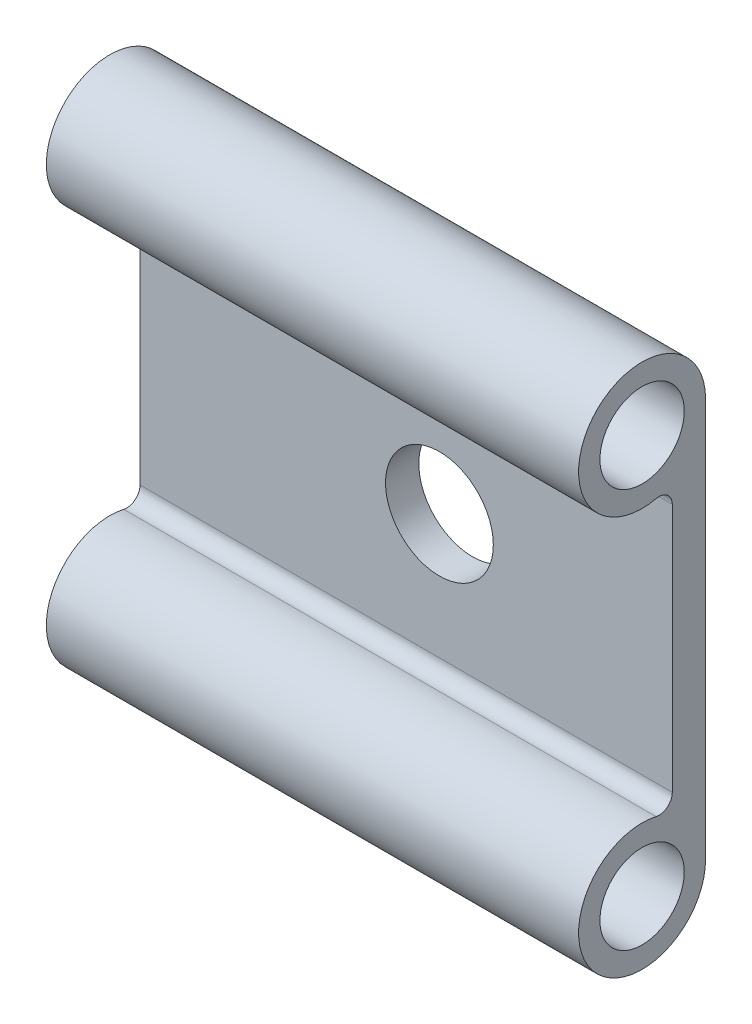
ISO-10303-21;
HEADER;
FILE_DESCRIPTION(('STEP AP214'),'2;1');
FILE_NAME('part.step','',(''),(''),'','','');
FILE_SCHEMA(('AUTOMOTIVE_DESIGN { 1 0 10303 214 1 1 1 1 }'));
ENDSEC;
DATA;
#1=APPLICATION_CONTEXT('core data for automotive mechanical design processes');
#2=APPLICATION_PROTOCOL_DEFINITION('international standard','automotive_design',2000,#1);
#3=PRODUCT_CONTEXT('',#1,'mechanical');
#4=PRODUCT('Part','Part','',(#3));
#5=PRODUCT_RELATED_PRODUCT_CATEGORY('part','',(#4));
#6=PRODUCT_DEFINITION_FORMATION('','',#4);
#7=PRODUCT_DEFINITION_CONTEXT('part definition',#1,'design');
#8=PRODUCT_DEFINITION('design','',#6,#7);
#9=PRODUCT_DEFINITION_SHAPE('','',#8);
#10=(LENGTH_UNIT() NAMED_UNIT(*) SI_UNIT(.MILLI.,.METRE.));
#11=(NAMED_UNIT(*) PLANE_ANGLE_UNIT() SI_UNIT($,.RADIAN.));
#12=(NAMED_UNIT(*) SI_UNIT($,.STERADIAN.) SOLID_ANGLE_UNIT());
#13=UNCERTAINTY_MEASURE_WITH_UNIT(LENGTH_MEASURE(1.E-05),#10,'distance_accuracy_value','');
#14=(GEOMETRIC_REPRESENTATION_CONTEXT(3) GLOBAL_UNCERTAINTY_ASSIGNED_CONTEXT((#13)) GLOBAL_UNIT_ASSIGNED_CONTEXT((#10,
#11,#12)) REPRESENTATION_CONTEXT('',''));
#15=CARTESIAN_POINT('',(0.,0.,0.));
#16=DIRECTION('',(0.,0.,1.));
#17=DIRECTION('',(1.,0.,0.));
#18=AXIS2_PLACEMENT_3D('',#15,#16,#17);
#19=CARTESIAN_POINT('',(50.8,7.1481936179709,-1.6129));
#20=DIRECTION('',(-1.,0.,0.));
#21=DIRECTION('',(0.,0.,1.));
#22=AXIS2_PLACEMENT_3D('',#19,#20,#21);
#23=PLANE('',#22);
#24=CARTESIAN_POINT('',(50.8,7.1481936179709,-1.6129));
#25=DIRECTION('',(-1.,0.,0.));
#26=DIRECTION('',(0.,0.,1.));
#27=AXIS2_PLACEMENT_3D('',#24,#25,#26);
#28=CIRCLE('',#27,1.27);
#29=CARTESIAN_POINT('',(50.8,7.1481936179709,-2.8829));
#30=VERTEX_POINT('',#29);
#31=CARTESIAN_POINT('',(50.8,5.90933857152881,-1.33336793760832));
#32=VERTEX_POINT('',#31);
#33=EDGE_CURVE('E133',#30,#32,#28,.T.);
#34=ORIENTED_EDGE('',*,*,#33,.T.);
#35=CARTESIAN_POINT('',(50.8,0.,0.));
#36=DIRECTION('',(1.,0.,0.));
#37=DIRECTION('',(0.,0.,-1.));
#38=AXIS2_PLACEMENT_3D('',#35,#36,#37);
#39=CIRCLE('',#38,6.0579);
#40=CARTESIAN_POINT('',(50.8,0.,-6.05790000000001));
#41=VERTEX_POINT('',#40);
#42=EDGE_CURVE('E91',#32,#41,#39,.T.);
#43=ORIENTED_EDGE('',*,*,#42,.T.);
#44=DIRECTION('',(0.,1.,0.));
#45=VECTOR('',#44,1.);
#46=CARTESIAN_POINT('',(50.8,38.1,-6.0579));
#47=LINE('',#46,#45);
#48=CARTESIAN_POINT('',(50.8,38.1,-6.0579));
#49=VERTEX_POINT('',#48);
#50=EDGE_CURVE('E104',#41,#49,#47,.T.);
#51=ORIENTED_EDGE('',*,*,#50,.T.);
#52=CARTESIAN_POINT('',(50.8,38.1,0.));
#53=DIRECTION('',(1.,0.,0.));
#54=DIRECTION('',(0.,0.,1.));
#55=AXIS2_PLACEMENT_3D('',#52,#53,#54);
#56=CIRCLE('',#55,6.0579);
#57=CARTESIAN_POINT('',(50.8,32.1906614284712,-1.33336793760832));
#58=VERTEX_POINT('',#57);
#59=EDGE_CURVE('E98',#49,#58,#56,.T.);
#60=ORIENTED_EDGE('',*,*,#59,.T.);
#61=CARTESIAN_POINT('',(50.8,30.9518063820291,-1.6129));
#62=DIRECTION('',(-1.,0.,0.));
#63=DIRECTION('',(0.,0.,-1.));
#64=AXIS2_PLACEMENT_3D('',#61,#62,#63);
#65=CIRCLE('',#64,1.27);
#66=CARTESIAN_POINT('',(50.8,30.9518063820291,-2.8829));
#67=VERTEX_POINT('',#66);
#68=EDGE_CURVE('E102',#58,#67,#65,.T.);
#69=ORIENTED_EDGE('',*,*,#68,.T.);
#70=DIRECTION('',(0.,-1.,0.));
#71=VECTOR('',#70,1.);
#72=CARTESIAN_POINT('',(50.8,30.9518063820291,-2.8829));
#73=LINE('',#72,#71);
#74=EDGE_CURVE('E54',#67,#30,#73,.T.);
#75=ORIENTED_EDGE('',*,*,#74,.T.);
#76=EDGE_LOOP('',(#34,#43,#51,#60,#69,#75));
#77=FACE_BOUND('',#76,.T.);
#78=CARTESIAN_POINT('',(50.8,0.,0.));
#79=DIRECTION('',(1.,0.,0.));
#80=DIRECTION('',(0.,0.,-1.));
#81=AXIS2_PLACEMENT_3D('',#78,#79,#80);
#82=CIRCLE('',#81,4.0259);
#83=CARTESIAN_POINT('',(50.8,0.,-4.0259));
#84=VERTEX_POINT('',#83);
#85=EDGE_CURVE('E126',#84,#84,#82,.T.);
#86=ORIENTED_EDGE('',*,*,#85,.F.);
#87=EDGE_LOOP('',(#86));
#88=FACE_BOUND('',#87,.T.);
#89=CARTESIAN_POINT('',(50.8,38.1,0.));
#90=DIRECTION('',(1.,0.,0.));
#91=DIRECTION('',(0.,0.,-1.));
#92=AXIS2_PLACEMENT_3D('',#89,#90,#91);
#93=CIRCLE('',#92,4.0259);
#94=CARTESIAN_POINT('',(50.8,38.1,-4.0259));
#95=VERTEX_POINT('',#94);
#96=EDGE_CURVE('E187',#95,#95,#93,.T.);
#97=ORIENTED_EDGE('',*,*,#96,.F.);
#98=EDGE_LOOP('',(#97));
#99=FACE_BOUND('',#98,.T.);
#100=ADVANCED_FACE('F37',(#77,#88,#99),#23,.F.);
#101=CARTESIAN_POINT('',(0.,7.1481936179709,-1.6129));
#102=DIRECTION('',(-1.,0.,0.));
#103=DIRECTION('',(0.,0.,1.));
#104=AXIS2_PLACEMENT_3D('',#101,#102,#103);
#105=PLANE('',#104);
#106=CARTESIAN_POINT('',(0.,0.,0.));
#107=DIRECTION('',(1.,0.,0.));
#108=DIRECTION('',(0.,0.,-1.));
#109=AXIS2_PLACEMENT_3D('',#106,#107,#108);
#110=CIRCLE('',#109,4.0259);
#111=CARTESIAN_POINT('',(0.,0.,-4.0259));
#112=VERTEX_POINT('',#111);
#113=EDGE_CURVE('E190',#112,#112,#110,.T.);
#114=ORIENTED_EDGE('',*,*,#113,.T.);
#115=EDGE_LOOP('',(#114));
#116=FACE_BOUND('',#115,.T.);
#117=CARTESIAN_POINT('',(0.,7.1481936179709,-1.6129));
#118=DIRECTION('',(-1.,0.,0.));
#119=DIRECTION('',(0.,0.,1.));
#120=AXIS2_PLACEMENT_3D('',#117,#118,#119);
#121=CIRCLE('',#120,1.27);
#122=CARTESIAN_POINT('',(0.,7.1481936179709,-2.8829));
#123=VERTEX_POINT('',#122);
#124=CARTESIAN_POINT('',(0.,5.90933857152881,-1.33336793760832));
#125=VERTEX_POINT('',#124);
#126=EDGE_CURVE('E122',#123,#125,#121,.T.);
#127=ORIENTED_EDGE('',*,*,#126,.F.);
#128=DIRECTION('',(0.,-1.,0.));
#129=VECTOR('',#128,1.);
#130=CARTESIAN_POINT('',(0.,30.9518063820291,-2.8829));
#131=LINE('',#130,#129);
#132=CARTESIAN_POINT('',(0.,30.9518063820291,-2.8829));
#133=VERTEX_POINT('',#132);
#134=EDGE_CURVE('E83',#133,#123,#131,.T.);
#135=ORIENTED_EDGE('',*,*,#134,.F.);
#136=CARTESIAN_POINT('',(0.,30.9518063820291,-1.6129));
#137=DIRECTION('',(-1.,0.,0.));
#138=DIRECTION('',(0.,0.,-1.));
#139=AXIS2_PLACEMENT_3D('',#136,#137,#138);
#140=CIRCLE('',#139,1.27);
#141=CARTESIAN_POINT('',(0.,32.1906614284712,-1.33336793760832));
#142=VERTEX_POINT('',#141);
#143=EDGE_CURVE('E77',#142,#133,#140,.T.);
#144=ORIENTED_EDGE('',*,*,#143,.F.);
#145=CARTESIAN_POINT('',(0.,38.1,0.));
#146=DIRECTION('',(1.,0.,0.));
#147=DIRECTION('',(0.,0.,1.));
#148=AXIS2_PLACEMENT_3D('',#145,#146,#147);
#149=CIRCLE('',#148,6.0579);
#150=CARTESIAN_POINT('',(0.,38.1,-6.0579));
#151=VERTEX_POINT('',#150);
#152=EDGE_CURVE('E112',#151,#142,#149,.T.);
#153=ORIENTED_EDGE('',*,*,#152,.F.);
#154=DIRECTION('',(0.,1.,0.));
#155=VECTOR('',#154,1.);
#156=CARTESIAN_POINT('',(0.,38.1,-6.0579));
#157=LINE('',#156,#155);
#158=CARTESIAN_POINT('',(0.,0.,-6.05790000000001));
#159=VERTEX_POINT('',#158);
#160=EDGE_CURVE('E128',#159,#151,#157,.T.);
#161=ORIENTED_EDGE('',*,*,#160,.F.);
#162=CARTESIAN_POINT('',(0.,0.,0.));
#163=DIRECTION('',(1.,0.,0.));
#164=DIRECTION('',(0.,0.,-1.));
#165=AXIS2_PLACEMENT_3D('',#162,#163,#164);
#166=CIRCLE('',#165,6.0579);
#167=EDGE_CURVE('E125',#125,#159,#166,.T.);
#168=ORIENTED_EDGE('',*,*,#167,.F.);
#169=EDGE_LOOP('',(#127,#135,#144,#153,#161,#168));
#170=FACE_BOUND('',#169,.T.);
#171=CARTESIAN_POINT('',(0.,38.1,0.));
#172=DIRECTION('',(1.,0.,0.));
#173=DIRECTION('',(0.,0.,-1.));
#174=AXIS2_PLACEMENT_3D('',#171,#172,#173);
#175=CIRCLE('',#174,4.0259);
#176=CARTESIAN_POINT('',(0.,38.1,-4.0259));
#177=VERTEX_POINT('',#176);
#178=EDGE_CURVE('E184',#177,#177,#175,.T.);
#179=ORIENTED_EDGE('',*,*,#178,.T.);
#180=EDGE_LOOP('',(#179));
#181=FACE_BOUND('',#180,.T.);
#182=ADVANCED_FACE('F142',(#116,#170,#181),#105,.T.);
#183=CARTESIAN_POINT('',(50.8,7.1481936179709,-1.6129));
#184=DIRECTION('',(-1.,0.,0.));
#185=DIRECTION('',(0.,0.,1.));
#186=AXIS2_PLACEMENT_3D('',#183,#184,#185);
#187=CYLINDRICAL_SURFACE('',#186,1.27);
#188=ORIENTED_EDGE('',*,*,#126,.T.);
#189=DIRECTION('',(-1.,0.,0.));
#190=VECTOR('',#189,1.);
#191=CARTESIAN_POINT('',(50.8,5.90933857152881,-1.33336793760832));
#192=LINE('',#191,#190);
#193=EDGE_CURVE('E11',#32,#125,#192,.T.);
#194=ORIENTED_EDGE('',*,*,#193,.F.);
#195=ORIENTED_EDGE('',*,*,#33,.F.);
#196=DIRECTION('',(-1.,0.,0.));
#197=VECTOR('',#196,1.);
#198=CARTESIAN_POINT('',(50.8,7.1481936179709,-2.8829));
#199=LINE('',#198,#197);
#200=EDGE_CURVE('E118',#30,#123,#199,.T.);
#201=ORIENTED_EDGE('',*,*,#200,.T.);
#202=EDGE_LOOP('',(#188,#194,#195,#201));
#203=FACE_BOUND('',#202,.T.);
#204=ADVANCED_FACE('F39',(#203),#187,.F.);
#205=CARTESIAN_POINT('',(50.8,0.,0.));
#206=DIRECTION('',(-1.,0.,0.));
#207=DIRECTION('',(0.,0.,1.));
#208=AXIS2_PLACEMENT_3D('',#205,#206,#207);
#209=CYLINDRICAL_SURFACE('',#208,6.0579);
#210=ORIENTED_EDGE('',*,*,#167,.T.);
#211=DIRECTION('',(-1.,0.,0.));
#212=VECTOR('',#211,1.);
#213=CARTESIAN_POINT('',(50.8,0.,-6.05790000000001));
#214=LINE('',#213,#212);
#215=EDGE_CURVE('E46',#41,#159,#214,.T.);
#216=ORIENTED_EDGE('',*,*,#215,.F.);
#217=ORIENTED_EDGE('',*,*,#42,.F.);
#218=ORIENTED_EDGE('',*,*,#193,.T.);
#219=EDGE_LOOP('',(#210,#216,#217,#218));
#220=FACE_BOUND('',#219,.T.);
#221=ADVANCED_FACE('F207',(#220),#209,.T.);
#222=CARTESIAN_POINT('',(50.8,38.1,-6.0579));
#223=DIRECTION('',(0.,0.,1.));
#224=DIRECTION('',(0.,-1.,0.));
#225=AXIS2_PLACEMENT_3D('',#222,#223,#224);
#226=PLANE('',#225);
#227=CARTESIAN_POINT('',(28.575,19.05,-6.05790000000001));
#228=DIRECTION('',(0.,0.,1.));
#229=DIRECTION('',(1.,0.,0.));
#230=AXIS2_PLACEMENT_3D('',#227,#228,#229);
#231=CIRCLE('',#230,5.1435);
#232=CARTESIAN_POINT('',(33.7185,19.05,-6.05790000000001));
#233=VERTEX_POINT('',#232);
#234=EDGE_CURVE('E180',#233,#233,#231,.T.);
#235=ORIENTED_EDGE('',*,*,#234,.T.);
#236=EDGE_LOOP('',(#235));
#237=FACE_BOUND('',#236,.T.);
#238=ORIENTED_EDGE('',*,*,#160,.T.);
#239=DIRECTION('',(-1.,0.,0.));
#240=VECTOR('',#239,1.);
#241=CARTESIAN_POINT('',(50.8,38.1,-6.0579));
#242=LINE('',#241,#240);
#243=EDGE_CURVE('E113',#49,#151,#242,.T.);
#244=ORIENTED_EDGE('',*,*,#243,.F.);
#245=ORIENTED_EDGE('',*,*,#50,.F.);
#246=ORIENTED_EDGE('',*,*,#215,.T.);
#247=EDGE_LOOP('',(#238,#244,#245,#246));
#248=FACE_BOUND('',#247,.T.);
#249=ADVANCED_FACE('F139',(#237,#248),#226,.F.);
#250=CARTESIAN_POINT('',(50.8,38.1,0.));
#251=DIRECTION('',(-1.,0.,0.));
#252=DIRECTION('',(0.,0.,1.));
#253=AXIS2_PLACEMENT_3D('',#250,#251,#252);
#254=CYLINDRICAL_SURFACE('',#253,6.0579);
#255=ORIENTED_EDGE('',*,*,#152,.T.);
#256=DIRECTION('',(-1.,0.,0.));
#257=VECTOR('',#256,1.);
#258=CARTESIAN_POINT('',(50.8,32.1906614284712,-1.33336793760832));
#259=LINE('',#258,#257);
#260=EDGE_CURVE('E109',#58,#142,#259,.T.);
#261=ORIENTED_EDGE('',*,*,#260,.F.);
#262=ORIENTED_EDGE('',*,*,#59,.F.);
#263=ORIENTED_EDGE('',*,*,#243,.T.);
#264=EDGE_LOOP('',(#255,#261,#262,#263));
#265=FACE_BOUND('',#264,.T.);
#266=ADVANCED_FACE('F110',(#265),#254,.T.);
#267=CARTESIAN_POINT('',(50.8,30.9518063820291,-1.6129));
#268=DIRECTION('',(-1.,0.,0.));
#269=DIRECTION('',(0.,0.,1.));
#270=AXIS2_PLACEMENT_3D('',#267,#268,#269);
#271=CYLINDRICAL_SURFACE('',#270,1.27);
#272=ORIENTED_EDGE('',*,*,#143,.T.);
#273=DIRECTION('',(-1.,0.,0.));
#274=VECTOR('',#273,1.);
#275=CARTESIAN_POINT('',(50.8,30.9518063820291,-2.8829));
#276=LINE('',#275,#274);
#277=EDGE_CURVE('E114',#67,#133,#276,.T.);
#278=ORIENTED_EDGE('',*,*,#277,.F.);
#279=ORIENTED_EDGE('',*,*,#68,.F.);
#280=ORIENTED_EDGE('',*,*,#260,.T.);
#281=EDGE_LOOP('',(#272,#278,#279,#280));
#282=FACE_BOUND('',#281,.T.);
#283=ADVANCED_FACE('F116',(#282),#271,.F.);
#284=CARTESIAN_POINT('',(50.8,30.9518063820291,-2.8829));
#285=DIRECTION('',(0.,0.,-1.));
#286=DIRECTION('',(0.,1.,0.));
#287=AXIS2_PLACEMENT_3D('',#284,#285,#286);
#288=PLANE('',#287);
#289=CARTESIAN_POINT('',(28.575,19.05,-2.8829));
#290=DIRECTION('',(0.,0.,1.));
#291=DIRECTION('',(1.,0.,0.));
#292=AXIS2_PLACEMENT_3D('',#289,#290,#291);
#293=CIRCLE('',#292,5.1435);
#294=CARTESIAN_POINT('',(33.7185,19.05,-2.8829));
#295=VERTEX_POINT('',#294);
#296=EDGE_CURVE('E182',#295,#295,#293,.T.);
#297=ORIENTED_EDGE('',*,*,#296,.F.);
#298=EDGE_LOOP('',(#297));
#299=FACE_BOUND('',#298,.T.);
#300=ORIENTED_EDGE('',*,*,#134,.T.);
#301=ORIENTED_EDGE('',*,*,#200,.F.);
#302=ORIENTED_EDGE('',*,*,#74,.F.);
#303=ORIENTED_EDGE('',*,*,#277,.T.);
#304=EDGE_LOOP('',(#300,#301,#302,#303));
#305=FACE_BOUND('',#304,.T.);
#306=ADVANCED_FACE('F147',(#299,#305),#288,.F.);
#307=CARTESIAN_POINT('',(50.8,0.,0.));
#308=DIRECTION('',(-1.,0.,0.));
#309=DIRECTION('',(0.,0.,1.));
#310=AXIS2_PLACEMENT_3D('',#307,#308,#309);
#311=CYLINDRICAL_SURFACE('',#310,4.0259);
#312=ORIENTED_EDGE('',*,*,#85,.T.);
#313=EDGE_LOOP('',(#312));
#314=FACE_BOUND('',#313,.T.);
#315=ORIENTED_EDGE('',*,*,#113,.F.);
#316=EDGE_LOOP('',(#315));
#317=FACE_BOUND('',#316,.T.);
#318=ADVANCED_FACE('F149',(#314,#317),#311,.F.);
#319=CARTESIAN_POINT('',(50.8,38.1,0.));
#320=DIRECTION('',(-1.,0.,0.));
#321=DIRECTION('',(0.,0.,1.));
#322=AXIS2_PLACEMENT_3D('',#319,#320,#321);
#323=CYLINDRICAL_SURFACE('',#322,4.0259);
#324=ORIENTED_EDGE('',*,*,#96,.T.);
#325=EDGE_LOOP('',(#324));
#326=FACE_BOUND('',#325,.T.);
#327=ORIENTED_EDGE('',*,*,#178,.F.);
#328=EDGE_LOOP('',(#327));
#329=FACE_BOUND('',#328,.T.);
#330=ADVANCED_FACE('F156',(#326,#329),#323,.F.);
#331=CARTESIAN_POINT('',(28.575,19.05,-6.05790000000001));
#332=DIRECTION('',(0.,0.,1.));
#333=DIRECTION('',(0.,-1.,0.));
#334=AXIS2_PLACEMENT_3D('',#331,#332,#333);
#335=CYLINDRICAL_SURFACE('',#334,5.1435);
#336=ORIENTED_EDGE('',*,*,#234,.F.);
#337=EDGE_LOOP('',(#336));
#338=FACE_BOUND('',#337,.T.);
#339=ORIENTED_EDGE('',*,*,#296,.T.);
#340=EDGE_LOOP('',(#339));
#341=FACE_BOUND('',#340,.T.);
#342=ADVANCED_FACE('F171',(#338,#341),#335,.F.);
#343=CLOSED_SHELL('',(#100,#182,#204,#221,#249,#266,#283,#306,#318,#330,#342));
#344=MANIFOLD_SOLID_BREP('B2',#343);
#345=ADVANCED_BREP_SHAPE_REPRESENTATION('',(#18,#344),#14);
#346=SHAPE_DEFINITION_REPRESENTATION(#9,#345);
ENDSEC;
END-ISO-10303-21;
